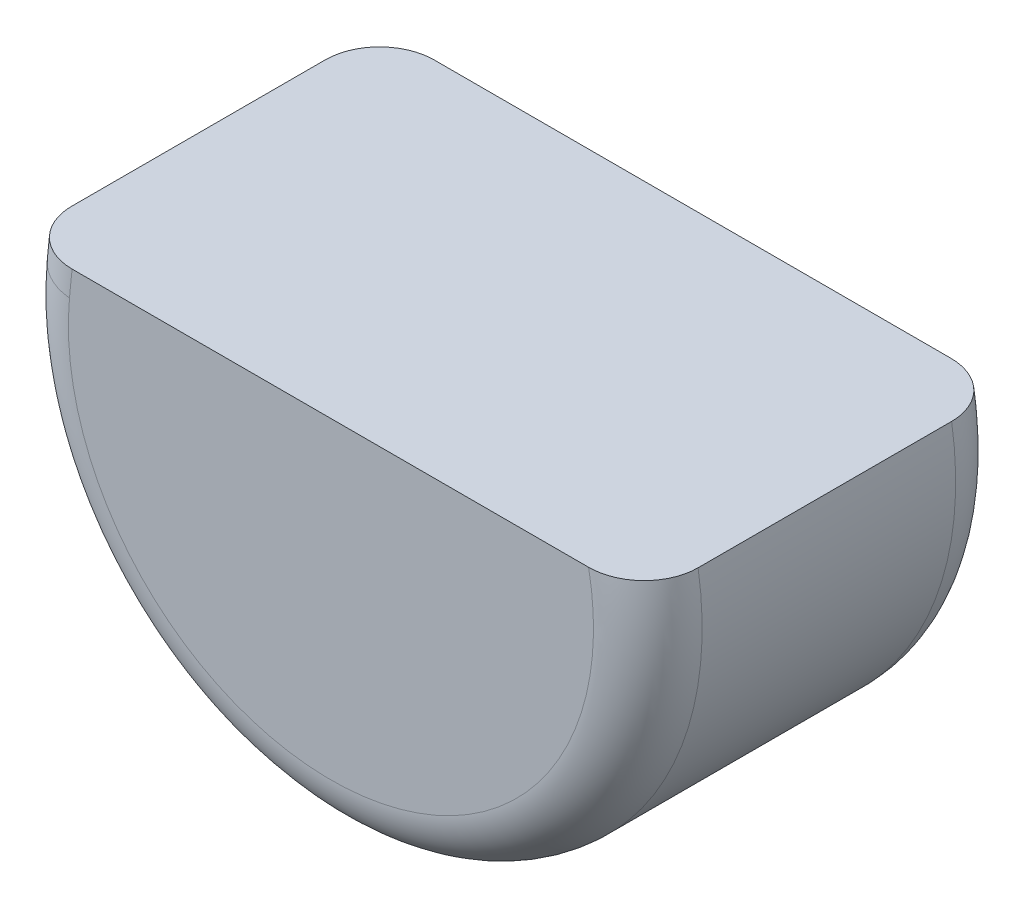
ISO-10303-21;
HEADER;
FILE_DESCRIPTION(('STEP AP214'),'2;1');
FILE_NAME('part.step','',(''),(''),'','','');
FILE_SCHEMA(('AUTOMOTIVE_DESIGN { 1 0 10303 214 1 1 1 1 }'));
ENDSEC;
DATA;
#1=APPLICATION_CONTEXT('core data for automotive mechanical design processes');
#2=APPLICATION_PROTOCOL_DEFINITION('international standard','automotive_design',2000,#1);
#3=PRODUCT_CONTEXT('',#1,'mechanical');
#4=PRODUCT('Part','Part','',(#3));
#5=PRODUCT_RELATED_PRODUCT_CATEGORY('part','',(#4));
#6=PRODUCT_DEFINITION_FORMATION('','',#4);
#7=PRODUCT_DEFINITION_CONTEXT('part definition',#1,'design');
#8=PRODUCT_DEFINITION('design','',#6,#7);
#9=PRODUCT_DEFINITION_SHAPE('','',#8);
#10=(LENGTH_UNIT() NAMED_UNIT(*) SI_UNIT(.MILLI.,.METRE.));
#11=(NAMED_UNIT(*) PLANE_ANGLE_UNIT() SI_UNIT($,.RADIAN.));
#12=(NAMED_UNIT(*) SI_UNIT($,.STERADIAN.) SOLID_ANGLE_UNIT());
#13=UNCERTAINTY_MEASURE_WITH_UNIT(LENGTH_MEASURE(1.E-05),#10,'distance_accuracy_value','');
#14=(GEOMETRIC_REPRESENTATION_CONTEXT(3) GLOBAL_UNCERTAINTY_ASSIGNED_CONTEXT((#13)) GLOBAL_UNIT_ASSIGNED_CONTEXT((#10,
#11,#12)) REPRESENTATION_CONTEXT('',''));
#15=CARTESIAN_POINT('',(0.,0.,0.));
#16=DIRECTION('',(0.,0.,1.));
#17=DIRECTION('',(1.,0.,0.));
#18=AXIS2_PLACEMENT_3D('',#15,#16,#17);
#19=CARTESIAN_POINT('',(0.,33.,0.));
#20=DIRECTION('',(0.,1.,0.));
#21=DIRECTION('',(0.,0.,1.));
#22=AXIS2_PLACEMENT_3D('',#19,#20,#21);
#23=PLANE('',#22);
#24=CARTESIAN_POINT('',(-16.4073101237455,33.,-8.81303590751504));
#25=CARTESIAN_POINT('',(-16.3046430269369,33.,-8.94763315762563));
#26=CARTESIAN_POINT('',(-16.1904843123542,33.,-9.07362536051019));
#27=CARTESIAN_POINT('',(-15.9425101415721,33.,-9.30472810824802));
#28=CARTESIAN_POINT('',(-15.8086699437999,33.,-9.40981197217893));
#29=CARTESIAN_POINT('',(-15.5253491277104,33.,-9.59598278584179));
#30=CARTESIAN_POINT('',(-15.3758795937249,33.,-9.6770865880813));
#31=CARTESIAN_POINT('',(-15.0655275551264,33.,-9.81313260898029));
#32=CARTESIAN_POINT('',(-14.9046478945889,33.,-9.86808132087928));
#33=CARTESIAN_POINT('',(-14.575344004913,33.,-9.9505174006537));
#34=CARTESIAN_POINT('',(-14.4068932463829,33.,-9.97789881371756));
#35=CARTESIAN_POINT('',(-14.0677769562788,33.,-10.0040871476085));
#36=CARTESIAN_POINT('',(-13.8971112886447,33.,-10.0028923046342));
#37=CARTESIAN_POINT('',(-13.5578786420935,33.,-9.97191556360741));
#38=CARTESIAN_POINT('',(-13.389319432232,33.,-9.94204849239308));
#39=CARTESIAN_POINT('',(-13.0596105929529,33.,-9.85442577074404));
#40=CARTESIAN_POINT('',(-12.8984609733782,33.,-9.79667008326352));
#41=CARTESIAN_POINT('',(-12.5882603931464,33.,-9.6549051298579));
#42=CARTESIAN_POINT('',(-12.439202777593,33.,-9.57091042989173));
#43=CARTESIAN_POINT('',(-12.1573801239298,33.,-9.3789924702912));
#44=CARTESIAN_POINT('',(-12.0246147613571,33.,-9.27106968730873));
#45=CARTESIAN_POINT('',(-11.779738166977,33.,-9.03480823569773));
#46=CARTESIAN_POINT('',(-11.6675454851418,33.,-8.90655399821113));
#47=CARTESIAN_POINT('',(-11.4664358089833,33.,-8.6329359440335));
#48=CARTESIAN_POINT('',(-11.3775180972094,33.,-8.48757265492905));
#49=CARTESIAN_POINT('',(-11.2260312484106,33.,-8.18477104622833));
#50=CARTESIAN_POINT('',(-11.1633115824605,33.,-8.02740803158696));
#51=CARTESIAN_POINT('',(-11.0653297341971,33.,-7.70435457149843));
#52=CARTESIAN_POINT('',(-11.0300666937301,33.,-7.53866438648833));
#53=CARTESIAN_POINT('',(-10.988148801575,33.,-7.20453374196073));
#54=CARTESIAN_POINT('',(-10.9813541751074,33.,-7.0361108053519));
#55=CARTESIAN_POINT('',(-10.9961896691112,33.,-6.70052325422526));
#56=CARTESIAN_POINT('',(-11.0178193704601,33.,-6.53335862119005));
#57=CARTESIAN_POINT('',(-11.0888046808636,33.,-6.20531773947316));
#58=CARTESIAN_POINT('',(-11.1381142066283,33.,-6.0444315129845));
#59=CARTESIAN_POINT('',(-11.2629814894278,33.,-5.73319223422878));
#60=CARTESIAN_POINT('',(-11.3385394431608,33.,-5.58283926090504));
#61=CARTESIAN_POINT('',(-11.513919865419,33.,-5.29653222420411));
#62=CARTESIAN_POINT('',(-11.6137996197785,33.,-5.16061325930705));
#63=CARTESIAN_POINT('',(-11.8348500979571,33.,-4.9073616549635));
#64=CARTESIAN_POINT('',(-11.9560213688559,33.,-4.79002949324719));
#65=CARTESIAN_POINT('',(-12.2168901421455,33.,-4.57661586848594));
#66=CARTESIAN_POINT('',(-12.3566817395726,33.,-4.48064942986393));
#67=CARTESIAN_POINT('',(-12.6503193707154,33.,-4.31339186597227));
#68=CARTESIAN_POINT('',(-12.804165848238,33.,-4.24210152023324));
#69=CARTESIAN_POINT('',(-13.1224855965064,33.,-4.1258079593305));
#70=CARTESIAN_POINT('',(-13.2870142572029,33.,-4.08095633438114));
#71=CARTESIAN_POINT('',(-13.6212564743185,33.,-4.0194017969686));
#72=CARTESIAN_POINT('',(-13.7909701556394,33.,-4.00269956314015));
#73=CARTESIAN_POINT('',(-14.1314080635389,33.,-3.99789607920253));
#74=CARTESIAN_POINT('',(-14.3021337378448,33.,-4.00989670429432));
#75=CARTESIAN_POINT('',(-14.639149281904,33.,-4.0623889888193));
#76=CARTESIAN_POINT('',(-14.8054391320297,33.,-4.10288077429893));
#77=CARTESIAN_POINT('',(-15.1288401099813,33.,-4.21124399114672));
#78=CARTESIAN_POINT('',(-15.2859516321,33.,-4.27911424536827));
#79=CARTESIAN_POINT('',(-15.5864954828023,33.,-4.44035707210239));
#80=CARTESIAN_POINT('',(-15.7299279862934,33.,-4.53372931847342));
#81=CARTESIAN_POINT('',(-15.9984932502313,33.,-4.74299851375184));
#82=CARTESIAN_POINT('',(-16.1236878186556,33.,-4.85881613088444));
#83=CARTESIAN_POINT('',(-16.3527289737071,33.,-5.10992569131406));
#84=CARTESIAN_POINT('',(-16.4565761134485,33.,-5.24521712988765));
#85=CARTESIAN_POINT('',(-16.639390331162,33.,-5.53067079704368));
#86=CARTESIAN_POINT('',(-16.7184856087249,33.,-5.68075092255804));
#87=CARTESIAN_POINT('',(-16.8502128288622,33.,-5.99210054459674));
#88=CARTESIAN_POINT('',(-16.9028465841001,33.,-6.15336927381951));
#89=CARTESIAN_POINT('',(-16.9799120399179,33.,-6.48166647270306));
#90=CARTESIAN_POINT('',(-17.0044817541569,33.,-6.64866255903098));
#91=CARTESIAN_POINT('',(-17.0251647419927,33.,-6.98445280821712));
#92=CARTESIAN_POINT('',(-17.0212713753178,33.,-7.15324738147999));
#93=CARTESIAN_POINT('',(-16.9851734955304,33.,-7.4874337722765));
#94=CARTESIAN_POINT('',(-16.953023494492,33.,-7.6528315144982));
#95=CARTESIAN_POINT('',(-16.8614404661866,33.,-7.9757417987829));
#96=CARTESIAN_POINT('',(-16.8020406062447,33.,-8.1332636692647));
#97=CARTESIAN_POINT('',(-16.685477568111,33.,-8.3779560047287));
#98=CARTESIAN_POINT('',(-16.6361766652183,33.,-8.46895779740036));
#99=CARTESIAN_POINT('',(-16.5284498398505,33.,-8.6453886320731));
#100=CARTESIAN_POINT('',(-16.47002393342,33.,-8.73081768387246));
#101=CARTESIAN_POINT('',(-16.4073101237455,33.,-8.81303590751504));
#102=B_SPLINE_CURVE_WITH_KNOTS('',3,(#24,#25,#26,#27,#28,#29,#30,#31,#32,#33,#34,#35,#36,#37,
#38,#39,#40,#41,#42,#43,#44,#45,#46,#47,#48,#49,#50,#51,#52,#53,#54,#55,#56,#57,#58,#59,#60,#61,
#62,#63,#64,#65,#66,#67,#68,#69,#70,#71,#72,#73,#74,#75,#76,#77,#78,#79,#80,#81,#82,#83,#84,#85,
#86,#87,#88,#89,#90,#91,#92,#93,#94,#95,#96,#97,#98,#99,#100,#101),.UNSPECIFIED.,.T.,.F.,(4,2,2,
2,2,2,2,2,2,2,2,2,2,2,2,2,2,2,2,2,2,2,2,2,2,2,2,2,2,2,2,2,2,2,2,2,2,2,4),(0.,0.507470923365044,
1.01558532959512,1.52334179400944,2.0309721374238,2.54054619212493,3.05015169915419,
3.56127572982144,4.07240043944136,4.58324191313572,5.09407321168662,5.60283620489981,
6.11158351365306,6.61736605265214,7.12313278284193,7.62641335836346,8.12968651299219,
8.63212425807561,9.13456576836447,9.63820233866499,10.1418518516626,10.6481505487478,
11.154465238613,11.6636554094113,12.1728578557573,12.6838702973127,13.1948849996292,
13.7058777330356,14.2168639317307,14.7260759769651,15.2352748267933,15.7417909307982,
16.2482723327812,16.7522520832566,17.2563494130337,17.7594763787647,18.2619925787247,
18.5719798273296,18.8819665308845),.UNSPECIFIED.);
#103=CARTESIAN_POINT('',(-17.0204674344962,33.,-6.99999999999999));
#104=VERTEX_POINT('',#103);
#105=CARTESIAN_POINT('',(-14.0037048343602,33.,-9.99999999999999));
#106=VERTEX_POINT('',#105);
#107=EDGE_CURVE('E41',#104,#106,#102,.T.);
#108=ORIENTED_EDGE('',*,*,#107,.F.);
#109=DIRECTION('',(0.,0.,-1.));
#110=VECTOR('',#109,1.);
#111=CARTESIAN_POINT('',(-17.0204674344962,33.,10.));
#112=LINE('',#111,#110);
#113=CARTESIAN_POINT('',(-17.0204674344962,33.,7.00000000000001));
#114=VERTEX_POINT('',#113);
#115=EDGE_CURVE('E157',#104,#114,#112,.F.);
#116=ORIENTED_EDGE('',*,*,#115,.T.);
#117=CARTESIAN_POINT('',(-17.0204248758986,33.,7.01593654982484));
#118=CARTESIAN_POINT('',(-17.0213136364574,33.,6.84811407135562));
#119=CARTESIAN_POINT('',(-17.0080107708837,33.,6.68009375999174));
#120=CARTESIAN_POINT('',(-16.9533436784081,33.,6.34854042206854));
#121=CARTESIAN_POINT('',(-16.9119456602839,33.,6.18501304606332));
#122=CARTESIAN_POINT('',(-16.8023081672937,33.,5.86731153717299));
#123=CARTESIAN_POINT('',(-16.7340844541274,33.,5.71313197317646));
#124=CARTESIAN_POINT('',(-16.5727964134387,33.,5.41842260329393));
#125=CARTESIAN_POINT('',(-16.4797380237194,33.,5.27788954556036));
#126=CARTESIAN_POINT('',(-16.2712021166225,33.,5.01402634912848));
#127=CARTESIAN_POINT('',(-16.1556709821443,33.,4.89073858946166));
#128=CARTESIAN_POINT('',(-15.9056394565939,33.,4.66518406787865));
#129=CARTESIAN_POINT('',(-15.7711378767979,33.,4.56291862424791));
#130=CARTESIAN_POINT('',(-15.4862575283728,33.,4.38175845782016));
#131=CARTESIAN_POINT('',(-15.3358014213151,33.,4.30298535532323));
#132=CARTESIAN_POINT('',(-15.0238480099141,33.,4.17167040771693));
#133=CARTESIAN_POINT('',(-14.8623504011345,33.,4.11912928620776));
#134=CARTESIAN_POINT('',(-14.5320194343979,33.,4.04150734696626));
#135=CARTESIAN_POINT('',(-14.3631530322734,33.,4.01656711925395));
#136=CARTESIAN_POINT('',(-14.0236271371739,33.,3.99530135962949));
#137=CARTESIAN_POINT('',(-13.8529676106123,33.,3.99897636465983));
#138=CARTESIAN_POINT('',(-13.5141834862324,33.,4.03488853843509));
#139=CARTESIAN_POINT('',(-13.3460675470745,33.,4.06720746924314));
#140=CARTESIAN_POINT('',(-13.0176520392605,33.,4.1596294676476));
#141=CARTESIAN_POINT('',(-12.8573524969514,33.,4.21973262889013));
#142=CARTESIAN_POINT('',(-12.5492636824473,33.,4.36600878090439));
#143=CARTESIAN_POINT('',(-12.4014654756577,33.,4.45216294830242));
#144=CARTESIAN_POINT('',(-12.1225099570881,33.,4.64815970971318));
#145=CARTESIAN_POINT('',(-11.9913523259184,33.,4.75800184896327));
#146=CARTESIAN_POINT('',(-11.7500038644396,33.,4.99778348211986));
#147=CARTESIAN_POINT('',(-11.6397278431074,33.,5.12763721756787));
#148=CARTESIAN_POINT('',(-11.4426948763693,33.,5.40410769851143));
#149=CARTESIAN_POINT('',(-11.3559371756911,33.,5.55072390547841));
#150=CARTESIAN_POINT('',(-11.2089391728453,33.,5.85563810116305));
#151=CARTESIAN_POINT('',(-11.1485468118509,33.,6.01386278583103));
#152=CARTESIAN_POINT('',(-11.0553286780791,33.,6.33823386514251));
#153=CARTESIAN_POINT('',(-11.022502065843,33.,6.50438001839097));
#154=CARTESIAN_POINT('',(-10.9854796875921,33.,6.83901965003611));
#155=CARTESIAN_POINT('',(-10.9811468001326,33.,7.00749797060988));
#156=CARTESIAN_POINT('',(-11.0008748469893,33.,7.34278212779973));
#157=CARTESIAN_POINT('',(-11.0249353859534,33.,7.50958798767063));
#158=CARTESIAN_POINT('',(-11.1006827399327,33.,7.83653940722773));
#159=CARTESIAN_POINT('',(-11.1523284068082,33.,7.99669450520807));
#160=CARTESIAN_POINT('',(-11.2817081657202,33.,8.30609283923196));
#161=CARTESIAN_POINT('',(-11.3594424756349,33.,8.45533598413205));
#162=CARTESIAN_POINT('',(-11.5389739902228,33.,8.73909895996857));
#163=CARTESIAN_POINT('',(-11.640831802245,33.,8.87358043795555));
#164=CARTESIAN_POINT('',(-11.8655690837403,33.,9.12364874196134));
#165=CARTESIAN_POINT('',(-11.9884491125334,33.,9.23923506509283));
#166=CARTESIAN_POINT('',(-12.2524378469981,33.,9.44889654286852));
#167=CARTESIAN_POINT('',(-12.393640296507,33.,9.54285365730107));
#168=CARTESIAN_POINT('',(-12.6897449358937,33.,9.70588413161206));
#169=CARTESIAN_POINT('',(-12.844647544526,33.,9.77495673055112));
#170=CARTESIAN_POINT('',(-13.1646942360533,33.,9.88665156471647));
#171=CARTESIAN_POINT('',(-13.3298911158737,33.,9.92912254324015));
#172=CARTESIAN_POINT('',(-13.6650628507862,33.,9.98583356231238));
#173=CARTESIAN_POINT('',(-13.8350378250586,33.,10.0000728980428));
#174=CARTESIAN_POINT('',(-14.1755590987031,33.,9.99992629223732));
#175=CARTESIAN_POINT('',(-14.3461053659078,33.,9.98544238275305));
#176=CARTESIAN_POINT('',(-14.6823470129256,33.,9.92804393837843));
#177=CARTESIAN_POINT('',(-14.8480423617467,33.,9.88512922188793));
#178=CARTESIAN_POINT('',(-15.1698293038638,33.,9.77205649126729));
#179=CARTESIAN_POINT('',(-15.325922692431,33.,9.70190358788442));
#180=CARTESIAN_POINT('',(-15.6240516980891,33.,9.53629906002571));
#181=CARTESIAN_POINT('',(-15.7660880808138,33.,9.44084881444636));
#182=CARTESIAN_POINT('',(-16.0315030137215,33.,9.22771847070338));
#183=CARTESIAN_POINT('',(-16.1549485671976,33.,9.11012181741087));
#184=CARTESIAN_POINT('',(-16.3802469445891,33.,8.85574019270526));
#185=CARTESIAN_POINT('',(-16.4820949661534,33.,8.71895096491098));
#186=CARTESIAN_POINT('',(-16.6607314757035,33.,8.43082184568565));
#187=CARTESIAN_POINT('',(-16.7376387626454,33.,8.27955551569802));
#188=CARTESIAN_POINT('',(-16.8647372211401,33.,7.96633412605654));
#189=CARTESIAN_POINT('',(-16.9149614971125,33.,7.80439259251221));
#190=CARTESIAN_POINT('',(-16.9735999841941,33.,7.53714115933734));
#191=CARTESIAN_POINT('',(-16.9906469062748,33.,7.43364638438056));
#192=CARTESIAN_POINT('',(-17.0137818616026,33.,7.22543896464659));
#193=CARTESIAN_POINT('',(-17.0198699262963,33.,7.12072632336495));
#194=CARTESIAN_POINT('',(-17.0204248758986,33.,7.01593654982484));
#195=B_SPLINE_CURVE_WITH_KNOTS('',3,(#117,#118,#119,#120,#121,#122,#123,#124,#125,#126,#127,
#128,#129,#130,#131,#132,#133,#134,#135,#136,#137,#138,#139,#140,#141,#142,#143,#144,#145,#146,
#147,#148,#149,#150,#151,#152,#153,#154,#155,#156,#157,#158,#159,#160,#161,#162,#163,#164,#165,
#166,#167,#168,#169,#170,#171,#172,#173,#174,#175,#176,#177,#178,#179,#180,#181,#182,#183,#184,
#185,#186,#187,#188,#189,#190,#191,#192,#193,#194),.UNSPECIFIED.,.T.,.F.,(4,2,2,2,2,2,2,2,2,2,2,
2,2,2,2,2,2,2,2,2,2,2,2,2,2,2,2,2,2,2,2,2,2,2,2,2,2,2,4),(0.,0.503090971573607,1.00678810670689,
1.5101897308368,2.01347110270557,2.51796830329335,3.0224971306803,3.52959429558104,
4.0367054478106,4.54638793827909,5.05607999256434,5.56723162935537,6.07838498898387,
6.58916988945866,7.09994498473734,7.60858911590819,8.11721691043877,8.62287120462503,
9.12851009958117,9.63171389717495,10.1349106882067,10.6373589591816,11.1398114264393,
11.6435398917172,12.1472817613534,12.6537108343753,13.1601553920916,13.6694540555144,
14.1787654336915,14.6898169359051,15.200871702462,15.711830625248,16.222761702634,
16.7318048366422,17.2409610412759,17.7476551153788,18.2537190800382,18.5678542348733,
18.8819884882948),.UNSPECIFIED.);
#196=CARTESIAN_POINT('',(-14.0037048343602,33.,10.));
#197=VERTEX_POINT('',#196);
#198=EDGE_CURVE('E121',#197,#114,#195,.T.);
#199=ORIENTED_EDGE('',*,*,#198,.F.);
#200=DIRECTION('',(-1.,0.,0.));
#201=VECTOR('',#200,1.);
#202=CARTESIAN_POINT('',(47.0492055521793,33.,10.));
#203=LINE('',#202,#201);
#204=CARTESIAN_POINT('',(14.5189629075543,33.,10.));
#205=VERTEX_POINT('',#204);
#206=EDGE_CURVE('E158',#205,#197,#203,.T.);
#207=ORIENTED_EDGE('',*,*,#206,.F.);
#208=CARTESIAN_POINT('',(11.6102886868545,33.,7.96378165278556));
#209=CARTESIAN_POINT('',(11.5561989360634,33.,7.80894350169198));
#210=CARTESIAN_POINT('',(11.515042002115,33.,7.64947446571004));
#211=CARTESIAN_POINT('',(11.4600735989835,33.,7.32577539608614));
#212=CARTESIAN_POINT('',(11.4462882618244,33.,7.1615409644513));
#213=CARTESIAN_POINT('',(11.446594989443,33.,6.83313025606573));
#214=CARTESIAN_POINT('',(11.4606794468749,33.,6.66895397567651));
#215=CARTESIAN_POINT('',(11.5162206542621,33.,6.34534194833683));
#216=CARTESIAN_POINT('',(11.5576726189565,33.,6.18590537773123));
#217=CARTESIAN_POINT('',(11.6665487265678,33.,5.87613276561319));
#218=CARTESIAN_POINT('',(11.7339794768822,33.,5.72579905056982));
#219=CARTESIAN_POINT('',(11.8926404358899,33.,5.43827042660729));
#220=CARTESIAN_POINT('',(11.9838733841002,33.,5.30107703256152));
#221=CARTESIAN_POINT('',(12.1894334832384,33.,5.0407148261468));
#222=CARTESIAN_POINT('',(12.3041890767046,33.,4.91788445065731));
#223=CARTESIAN_POINT('',(12.5522147644531,33.,4.69261370771054));
#224=CARTESIAN_POINT('',(12.6854873499631,33.,4.59017608836018));
#225=CARTESIAN_POINT('',(12.9705845424177,33.,4.40577350735854));
#226=CARTESIAN_POINT('',(13.1228081014657,33.,4.32442507166192));
#227=CARTESIAN_POINT('',(13.438582954502,33.,4.1879281502731));
#228=CARTESIAN_POINT('',(13.6021354108815,33.,4.13278235765507));
#229=CARTESIAN_POINT('',(13.9390046289141,33.,4.04940938829727));
#230=CARTESIAN_POINT('',(14.1124419134337,33.,4.02166829194393));
#231=CARTESIAN_POINT('',(14.4615192687116,33.,3.9956213805549));
#232=CARTESIAN_POINT('',(14.637159406673,33.,3.99731646573098));
#233=CARTESIAN_POINT('',(14.9860391518049,33.,4.03025730109238));
#234=CARTESIAN_POINT('',(15.1592727792543,33.,4.06156663993168));
#235=CARTESIAN_POINT('',(15.4979249809462,33.,4.15311861219944));
#236=CARTESIAN_POINT('',(15.6633438792356,33.,4.2133600447661));
#237=CARTESIAN_POINT('',(15.9798760594435,33.,4.36049394374254));
#238=CARTESIAN_POINT('',(16.1311152560281,33.,4.44711539304716));
#239=CARTESIAN_POINT('',(16.4166052311667,33.,4.64488980505213));
#240=CARTESIAN_POINT('',(16.550857346021,33.,4.75604083622617));
#241=CARTESIAN_POINT('',(16.7963941197603,33.,4.99791884040762));
#242=CARTESIAN_POINT('',(16.9079951904191,33.,5.1283246136132));
#243=CARTESIAN_POINT('',(17.1073427848729,33.,5.40624897454374));
#244=CARTESIAN_POINT('',(17.1950912392259,33.,5.55376617594225));
#245=CARTESIAN_POINT('',(17.3429667860165,33.,5.85947335086762));
#246=CARTESIAN_POINT('',(17.4034666433694,33.,6.01748306845187));
#247=CARTESIAN_POINT('',(17.4967989769561,33.,6.34147202180842));
#248=CARTESIAN_POINT('',(17.5296330899555,33.,6.50745078550043));
#249=CARTESIAN_POINT('',(17.5664541296584,33.,6.84101347815235));
#250=CARTESIAN_POINT('',(17.5707059050332,33.,7.00856822160024));
#251=CARTESIAN_POINT('',(17.5509376214868,33.,7.34199836332419));
#252=CARTESIAN_POINT('',(17.5269182995193,33.,7.50787380526158));
#253=CARTESIAN_POINT('',(17.4514350836094,33.,7.83279922049417));
#254=CARTESIAN_POINT('',(17.4000423911084,33.,7.99186575014402));
#255=CARTESIAN_POINT('',(17.2713962531224,33.,8.29916734472704));
#256=CARTESIAN_POINT('',(17.1941425273791,33.,8.44740229225617));
#257=CARTESIAN_POINT('',(17.0156579204929,33.,8.72958001796193));
#258=CARTESIAN_POINT('',(16.9143214895607,33.,8.86345600493979));
#259=CARTESIAN_POINT('',(16.6908285267304,33.,9.11251721553654));
#260=CARTESIAN_POINT('',(16.5686710963877,33.,9.22770163217884));
#261=CARTESIAN_POINT('',(16.3056425677403,33.,9.43745848668873));
#262=CARTESIAN_POINT('',(16.1645858832827,33.,9.53179814061515));
#263=CARTESIAN_POINT('',(15.8688180800916,33.,9.69585090547146));
#264=CARTESIAN_POINT('',(15.7141059687661,33.,9.76556222435976));
#265=CARTESIAN_POINT('',(15.3930101603211,33.,9.87947076241723));
#266=CARTESIAN_POINT('',(15.2264889788829,33.,9.92328039420827));
#267=CARTESIAN_POINT('',(14.8884956618606,33.,9.98276119323626));
#268=CARTESIAN_POINT('',(14.7170231111161,33.,9.9984299939304));
#269=CARTESIAN_POINT('',(14.3713446311439,33.,10.0013662875464));
#270=CARTESIAN_POINT('',(14.1971351163459,33.,9.98821871464553));
#271=CARTESIAN_POINT('',(13.853333309359,33.,9.93311778788711));
#272=CARTESIAN_POINT('',(13.6837411621287,33.,9.89116353074905));
#273=CARTESIAN_POINT('',(13.3525704265382,33.,9.77914785172742));
#274=CARTESIAN_POINT('',(13.1910675682191,33.,9.70886229659813));
#275=CARTESIAN_POINT('',(12.8821784767766,33.,9.54202752248851));
#276=CARTESIAN_POINT('',(12.7347958582311,33.,9.44547160283344));
#277=CARTESIAN_POINT('',(12.4592351387971,33.,9.22917627361162));
#278=CARTESIAN_POINT('',(12.3309735512289,33.,9.10954321341865));
#279=CARTESIAN_POINT('',(12.0969964985273,33.,8.85012747651096));
#280=CARTESIAN_POINT('',(11.9912511405565,33.,8.71037193335608));
#281=CARTESIAN_POINT('',(11.8394910489936,33.,8.46855802957089));
#282=CARTESIAN_POINT('',(11.7857383238132,33.,8.37126935910582));
#283=CARTESIAN_POINT('',(11.6894446826134,33.,8.17128828658046));
#284=CARTESIAN_POINT('',(11.6469035699574,33.,8.06859597933063));
#285=CARTESIAN_POINT('',(11.6102886868545,33.,7.96378165278556));
#286=B_SPLINE_CURVE_WITH_KNOTS('',3,(#208,#209,#210,#211,#212,#213,#214,#215,#216,#217,#218,
#219,#220,#221,#222,#223,#224,#225,#226,#227,#228,#229,#230,#231,#232,#233,#234,#235,#236,#237,
#238,#239,#240,#241,#242,#243,#244,#245,#246,#247,#248,#249,#250,#251,#252,#253,#254,#255,#256,
#257,#258,#259,#260,#261,#262,#263,#264,#265,#266,#267,#268,#269,#270,#271,#272,#273,#274,#275,
#276,#277,#278,#279,#280,#281,#282,#283,#284,#285),.UNSPECIFIED.,.T.,.F.,(4,2,2,2,2,2,2,2,2,2,2,
2,2,2,2,2,2,2,2,2,2,2,2,2,2,2,2,2,2,2,2,2,2,2,2,2,2,2,4),(0.,0.491641513464318,
0.983752178299271,1.47572853501785,1.96761889150443,2.45963443717518,2.95170663643837,
3.45369756201729,3.95575608965498,4.47115915675456,4.98661518487018,5.51105803054855,
6.03551691466748,6.56110449595807,7.08667026398081,7.60700900654132,8.12730679081779,
8.63974219057132,9.15213610300956,9.65728999837811,10.1624140056438,10.6628509199901,
11.1632747895383,11.6624033077373,12.1615372352122,12.6629004802308,13.1642853649951,
13.6710143865868,14.1777802719187,14.691949020079,15.2061610059597,15.7278282190855,
16.2495117906838,16.7754061226355,17.3014347182666,17.8250946890669,18.348055046575,
18.6808669384334,19.0136729928289),.UNSPECIFIED.);
#287=CARTESIAN_POINT('',(17.5660131781166,33.,7.00000000000001));
#288=VERTEX_POINT('',#287);
#289=EDGE_CURVE('E130',#288,#205,#286,.T.);
#290=ORIENTED_EDGE('',*,*,#289,.F.);
#291=DIRECTION('',(0.,0.,-1.));
#292=VECTOR('',#291,1.);
#293=CARTESIAN_POINT('',(17.5660131781166,33.,10.));
#294=LINE('',#293,#292);
#295=CARTESIAN_POINT('',(17.5660131781166,33.,-6.99999999999999));
#296=VERTEX_POINT('',#295);
#297=EDGE_CURVE('E11',#288,#296,#294,.T.);
#298=ORIENTED_EDGE('',*,*,#297,.T.);
#299=CARTESIAN_POINT('',(11.6102886868545,33.,-7.96378165278554));
#300=CARTESIAN_POINT('',(11.6659660354879,33.,-8.12311563784938));
#301=CARTESIAN_POINT('',(11.7354248741021,33.,-8.27778219698602));
#302=CARTESIAN_POINT('',(11.899570104065,33.,-8.57327357988291));
#303=CARTESIAN_POINT('',(11.9942937999616,33.,-8.71407751056114));
#304=CARTESIAN_POINT('',(12.2057333355745,33.,-8.97768973143249));
#305=CARTESIAN_POINT('',(12.3224132145569,33.,-9.10052687178769));
#306=CARTESIAN_POINT('',(12.5743372300363,33.,-9.3252942620895));
#307=CARTESIAN_POINT('',(12.7095769853463,33.,-9.42722943196897));
#308=CARTESIAN_POINT('',(12.9976451418846,33.,-9.60949835631384));
#309=CARTESIAN_POINT('',(13.1507665697555,33.,-9.6893690574809));
#310=CARTESIAN_POINT('',(13.4680921978104,33.,-9.82277700576562));
#311=CARTESIAN_POINT('',(13.6322979785954,33.,-9.87631048820243));
#312=CARTESIAN_POINT('',(13.9701512777869,33.,-9.95631251056429));
#313=CARTESIAN_POINT('',(14.1439121424467,33.,-9.98230328070578));
#314=CARTESIAN_POINT('',(14.4933386740929,33.,-10.0048059484243));
#315=CARTESIAN_POINT('',(14.6690043929403,33.,-10.0013170413712));
#316=CARTESIAN_POINT('',(15.01755173538,33.,-9.96479562216142));
#317=CARTESIAN_POINT('',(15.190428096303,33.,-9.9317127035916));
#318=CARTESIAN_POINT('',(15.5280666100416,33.,-9.83669193713391));
#319=CARTESIAN_POINT('',(15.6928291336649,33.,-9.77475540923028));
#320=CARTESIAN_POINT('',(16.0077299465434,33.,-9.62439597557291));
#321=CARTESIAN_POINT('',(16.1580003388813,33.,-9.53624986641832));
#322=CARTESIAN_POINT('',(16.4413058496228,33.,-9.33561232700703));
#323=CARTESIAN_POINT('',(16.5743423099906,33.,-9.22312279413724));
#324=CARTESIAN_POINT('',(16.8172491861191,33.,-8.97882111556683));
#325=CARTESIAN_POINT('',(16.9274402572985,33.,-8.84732779329861));
#326=CARTESIAN_POINT('',(17.1238057305323,33.,-8.56748622618583));
#327=CARTESIAN_POINT('',(17.2099820788938,33.,-8.41913934863402));
#328=CARTESIAN_POINT('',(17.3546303637733,33.,-8.11205045992561));
#329=CARTESIAN_POINT('',(17.4134739789617,33.,-7.9534834637517));
#330=CARTESIAN_POINT('',(17.5034288253889,33.,-7.62866993757589));
#331=CARTESIAN_POINT('',(17.5345416693189,33.,-7.46242385474501));
#332=CARTESIAN_POINT('',(17.5679276286514,33.,-7.12859325962095));
#333=CARTESIAN_POINT('',(17.5704604729616,33.,-6.96103467286007));
#334=CARTESIAN_POINT('',(17.5472845970762,33.,-6.62788538353964));
#335=CARTESIAN_POINT('',(17.5215765800574,33.,-6.4622946320862));
#336=CARTESIAN_POINT('',(17.442792611614,33.,-6.13817954380402));
#337=CARTESIAN_POINT('',(17.389781775886,33.,-5.97963936470821));
#338=CARTESIAN_POINT('',(17.2580155422371,33.,-5.67365072198737));
#339=CARTESIAN_POINT('',(17.1792598468741,33.,-5.5262023865356));
#340=CARTESIAN_POINT('',(16.9979048318186,33.,-5.24580679903089));
#341=CARTESIAN_POINT('',(16.8951958298508,33.,-5.11293051716667));
#342=CARTESIAN_POINT('',(16.6691459587028,33.,-4.86607910246859));
#343=CARTESIAN_POINT('',(16.545804159958,33.,-4.75210482168309));
#344=CARTESIAN_POINT('',(16.280593271685,33.,-4.54493919620644));
#345=CARTESIAN_POINT('',(16.1385381668704,33.,-4.45198605134931));
#346=CARTESIAN_POINT('',(15.8410175699533,33.,-4.29085049464106));
#347=CARTESIAN_POINT('',(15.6855511158926,33.,-4.22266986148336));
#348=CARTESIAN_POINT('',(15.3631882661897,33.,-4.11194367250548));
#349=CARTESIAN_POINT('',(15.196157606068,33.,-4.06978903743991));
#350=CARTESIAN_POINT('',(14.8574260574004,33.,-4.01368223193832));
#351=CARTESIAN_POINT('',(14.6857247882605,33.,-3.99973236684428));
#352=CARTESIAN_POINT('',(14.3398925700469,33.,-4.00027930744516));
#353=CARTESIAN_POINT('',(14.1657622104467,33.,-4.01518832668161));
#354=CARTESIAN_POINT('',(13.8224059625144,33.,-4.07378351442039));
#355=CARTESIAN_POINT('',(13.6531804173277,33.,-4.1174716912896));
#356=CARTESIAN_POINT('',(13.3230691622999,33.,-4.2328886778394));
#357=CARTESIAN_POINT('',(13.162259604966,33.,-4.304835552609));
#358=CARTESIAN_POINT('',(12.8550780303576,33.,-4.4748430305627));
#359=CARTESIAN_POINT('',(12.7087060948507,33.,-4.57290378163141));
#360=CARTESIAN_POINT('',(12.4355386521921,33.,-4.79193455696138));
#361=CARTESIAN_POINT('',(12.3086408131001,33.,-4.91277682901226));
#362=CARTESIAN_POINT('',(12.0774630330773,33.,-5.17444869002111));
#363=CARTESIAN_POINT('',(11.9731796572297,33.,-5.31527523817883));
#364=CARTESIAN_POINT('',(11.7926370267818,33.,-5.60979982413954));
#365=CARTESIAN_POINT('',(11.7158334428639,33.,-5.76316401534356));
#366=CARTESIAN_POINT('',(11.5898682716146,33.,-6.08090373714391));
#367=CARTESIAN_POINT('',(11.5407089054594,33.,-6.24528015137049));
#368=CARTESIAN_POINT('',(11.4727455925817,33.,-6.57562306833267));
#369=CARTESIAN_POINT('',(11.4531710925069,33.,-6.74143175641189));
#370=CARTESIAN_POINT('',(11.4426426930756,33.,-7.07380411630036));
#371=CARTESIAN_POINT('',(11.4516492279271,33.,-7.24036642593689));
#372=CARTESIAN_POINT('',(11.488063927309,33.,-7.49992934574703));
#373=CARTESIAN_POINT('',(11.5061137236002,33.,-7.59433933589713));
#374=CARTESIAN_POINT('',(11.5513844838587,33.,-7.78093053580681));
#375=CARTESIAN_POINT('',(11.5786051973136,33.,-7.87311180637231));
#376=CARTESIAN_POINT('',(11.6102886868545,33.,-7.96378165278554));
#377=B_SPLINE_CURVE_WITH_KNOTS('',3,(#299,#300,#301,#302,#303,#304,#305,#306,#307,#308,#309,
#310,#311,#312,#313,#314,#315,#316,#317,#318,#319,#320,#321,#322,#323,#324,#325,#326,#327,#328,
#329,#330,#331,#332,#333,#334,#335,#336,#337,#338,#339,#340,#341,#342,#343,#344,#345,#346,#347,
#348,#349,#350,#351,#352,#353,#354,#355,#356,#357,#358,#359,#360,#361,#362,#363,#364,#365,#366,
#367,#368,#369,#370,#371,#372,#373,#374,#375,#376),.UNSPECIFIED.,.T.,.F.,(4,2,2,2,2,2,2,2,2,2,2,
2,2,2,2,2,2,2,2,2,2,2,2,2,2,2,2,2,2,2,2,2,2,2,2,2,2,2,4),(0.,0.505982844354649,1.01271696816696,
1.51862825414669,2.02442032102977,2.54013591279037,3.055925200295,3.58052208798368,
4.10513329427697,4.63063975689814,5.15612218120483,5.67624105532741,6.19631940468484,
6.7085124592426,7.22066399031002,7.72563107235716,8.23056878598075,8.73091399821841,
9.23124675250579,9.73039172896896,10.2295424724825,10.7310253327082,11.2325307922117,
11.7394622220326,12.2464300428945,12.7608384037139,13.2752888084593,13.7971417500932,
14.3190311133355,14.8450294863163,15.3710308381239,15.8941658330695,16.4172213131641,
16.9292525354539,17.441324892894,17.9398152104875,18.437615750546,18.7255558273928,
19.0134880395131),.UNSPECIFIED.);
#378=CARTESIAN_POINT('',(14.5189629075543,33.,-9.99999999999999));
#379=VERTEX_POINT('',#378);
#380=EDGE_CURVE('E134',#379,#296,#377,.T.);
#381=ORIENTED_EDGE('',*,*,#380,.F.);
#382=DIRECTION('',(-1.,0.,0.));
#383=VECTOR('',#382,1.);
#384=CARTESIAN_POINT('',(47.0492055521793,33.,-9.99999999999999));
#385=LINE('',#384,#383);
#386=EDGE_CURVE('E50',#379,#106,#385,.T.);
#387=ORIENTED_EDGE('',*,*,#386,.T.);
#388=EDGE_LOOP('',(#108,#116,#199,#207,#290,#298,#381,#387));
#389=FACE_BOUND('',#388,.T.);
#390=ADVANCED_FACE('F37',(#389),#23,.T.);
#391=CARTESIAN_POINT('',(82.4405999624764,22.6319687377559,10.));
#392=DIRECTION('',(0.,0.,-1.));
#393=DIRECTION('',(-0.903921390927474,0.427698631075364,0.));
#394=AXIS2_PLACEMENT_3D('',#391,#392,#393);
#395=CYLINDRICAL_SURFACE('',#394,100.);
#396=ORIENTED_EDGE('',*,*,#115,.F.);
#397=CARTESIAN_POINT('',(82.4405999624764,22.6319687377559,-6.99999999999999));
#398=DIRECTION('',(0.,0.,1.));
#399=DIRECTION('',(0.903921390927474,-0.427698631075364,0.));
#400=AXIS2_PLACEMENT_3D('',#397,#398,#399);
#401=CIRCLE('',#400,100.);
#402=CARTESIAN_POINT('',(-17.1364326319272,31.8197094661983,-6.99999999999999));
#403=VERTEX_POINT('',#402);
#404=EDGE_CURVE('E111',#104,#403,#401,.T.);
#405=ORIENTED_EDGE('',*,*,#404,.T.);
#406=DIRECTION('',(0.,0.,-1.));
#407=VECTOR('',#406,1.);
#408=CARTESIAN_POINT('',(-17.1364326319272,31.8197094661983,10.));
#409=LINE('',#408,#407);
#410=CARTESIAN_POINT('',(-17.1364326319272,31.8197094661983,7.00000000000001));
#411=VERTEX_POINT('',#410);
#412=EDGE_CURVE('E100',#411,#403,#409,.T.);
#413=ORIENTED_EDGE('',*,*,#412,.F.);
#414=CARTESIAN_POINT('',(82.4405999624764,22.6319687377559,7.00000000000001));
#415=DIRECTION('',(0.,0.,1.));
#416=DIRECTION('',(0.903921390927474,-0.427698631075364,0.));
#417=AXIS2_PLACEMENT_3D('',#414,#415,#416);
#418=CIRCLE('',#417,100.);
#419=EDGE_CURVE('E110',#411,#114,#418,.F.);
#420=ORIENTED_EDGE('',*,*,#419,.T.);
#421=EDGE_LOOP('',(#396,#405,#413,#420));
#422=FACE_BOUND('',#421,.T.);
#423=ADVANCED_FACE('F109',(#422),#395,.T.);
#424=CARTESIAN_POINT('',(82.4405999624764,22.6319687377559,-6.99999999999999));
#425=DIRECTION('',(0.,0.,1.));
#426=DIRECTION('',(0.903921390927474,-0.427698631075364,0.));
#427=AXIS2_PLACEMENT_3D('',#424,#425,#426);
#428=TOROIDAL_SURFACE('',#427,97.,3.);
#429=ORIENTED_EDGE('',*,*,#404,.F.);
#430=ORIENTED_EDGE('',*,*,#107,.T.);
#431=CARTESIAN_POINT('',(82.4405999624764,22.6319687377559,-9.99999999999999));
#432=DIRECTION('',(0.,0.,1.));
#433=DIRECTION('',(0.903921390927474,-0.427698631075364,0.));
#434=AXIS2_PLACEMENT_3D('',#431,#432,#433);
#435=CIRCLE('',#434,97.);
#436=CARTESIAN_POINT('',(-14.1491216540951,31.544077244345,-9.99999999999999));
#437=VERTEX_POINT('',#436);
#438=EDGE_CURVE('E104',#437,#106,#435,.F.);
#439=ORIENTED_EDGE('',*,*,#438,.F.);
#440=CARTESIAN_POINT('',(-14.1491216540951,31.544077244345,-6.99999999999999));
#441=DIRECTION('',(0.0918774072844239,0.995770325944036,0.));
#442=DIRECTION('',(-0.995770325944036,0.0918774072844239,0.));
#443=AXIS2_PLACEMENT_3D('',#440,#441,#442);
#444=CIRCLE('',#443,3.);
#445=EDGE_CURVE('E113',#437,#403,#444,.T.);
#446=ORIENTED_EDGE('',*,*,#445,.T.);
#447=EDGE_LOOP('',(#429,#430,#439,#446));
#448=FACE_BOUND('',#447,.T.);
#449=ADVANCED_FACE('F145',(#448),#428,.T.);
#450=CARTESIAN_POINT('',(82.4405999624764,22.6319687377559,7.00000000000001));
#451=DIRECTION('',(0.,0.,1.));
#452=DIRECTION('',(0.903921390927474,-0.427698631075364,0.));
#453=AXIS2_PLACEMENT_3D('',#450,#451,#452);
#454=TOROIDAL_SURFACE('',#453,97.,3.);
#455=CARTESIAN_POINT('',(82.4405999624764,22.6319687377559,10.));
#456=DIRECTION('',(0.,0.,1.));
#457=DIRECTION('',(0.903921390927474,-0.427698631075364,0.));
#458=AXIS2_PLACEMENT_3D('',#455,#456,#457);
#459=CIRCLE('',#458,97.);
#460=CARTESIAN_POINT('',(-14.1491216540951,31.544077244345,10.));
#461=VERTEX_POINT('',#460);
#462=EDGE_CURVE('E135',#197,#461,#459,.T.);
#463=ORIENTED_EDGE('',*,*,#462,.F.);
#464=ORIENTED_EDGE('',*,*,#198,.T.);
#465=ORIENTED_EDGE('',*,*,#419,.F.);
#466=CARTESIAN_POINT('',(-14.1491216540951,31.544077244345,7.00000000000001));
#467=DIRECTION('',(0.091877407284424,0.995770325944036,0.));
#468=DIRECTION('',(-0.995770325944036,0.091877407284424,0.));
#469=AXIS2_PLACEMENT_3D('',#466,#467,#468);
#470=CIRCLE('',#469,3.);
#471=EDGE_CURVE('E119',#411,#461,#470,.T.);
#472=ORIENTED_EDGE('',*,*,#471,.T.);
#473=EDGE_LOOP('',(#463,#464,#465,#472));
#474=FACE_BOUND('',#473,.T.);
#475=ADVANCED_FACE('F118',(#474),#454,.T.);
#476=CARTESIAN_POINT('',(47.0492055521793,140.726715524264,10.));
#477=DIRECTION('',(0.,0.,1.));
#478=DIRECTION('',(0.903921390927474,-0.427698631075364,0.));
#479=AXIS2_PLACEMENT_3D('',#476,#477,#478);
#480=PLANE('',#479);
#481=CARTESIAN_POINT('',(0.289548072093415,30.2118548387208,10.));
#482=DIRECTION('',(0.,0.,1.));
#483=DIRECTION('',(0.903921390927474,-0.427698631075364,0.));
#484=AXIS2_PLACEMENT_3D('',#481,#482,#483);
#485=CIRCLE('',#484,14.5);
#486=EDGE_CURVE('E125',#461,#205,#485,.T.);
#487=ORIENTED_EDGE('',*,*,#486,.T.);
#488=ORIENTED_EDGE('',*,*,#206,.T.);
#489=ORIENTED_EDGE('',*,*,#462,.T.);
#490=EDGE_LOOP('',(#487,#488,#489));
#491=FACE_BOUND('',#490,.T.);
#492=ADVANCED_FACE('F144',(#491),#480,.T.);
#493=CARTESIAN_POINT('',(0.289548072093415,30.2118548387208,10.));
#494=DIRECTION('',(0.,0.,-1.));
#495=DIRECTION('',(-0.903921390927474,0.427698631075364,0.));
#496=AXIS2_PLACEMENT_3D('',#493,#494,#495);
#497=CYLINDRICAL_SURFACE('',#496,17.5);
#498=ORIENTED_EDGE('',*,*,#297,.F.);
#499=CARTESIAN_POINT('',(0.289548072093415,30.2118548387208,7.00000000000001));
#500=DIRECTION('',(0.,0.,1.));
#501=DIRECTION('',(0.903921390927474,-0.427698631075364,0.));
#502=AXIS2_PLACEMENT_3D('',#499,#500,#501);
#503=CIRCLE('',#502,17.5);
#504=EDGE_CURVE('E96',#288,#411,#503,.F.);
#505=ORIENTED_EDGE('',*,*,#504,.T.);
#506=ORIENTED_EDGE('',*,*,#412,.T.);
#507=CARTESIAN_POINT('',(0.289548072093415,30.2118548387208,-6.99999999999999));
#508=DIRECTION('',(0.,0.,1.));
#509=DIRECTION('',(0.903921390927474,-0.427698631075364,0.));
#510=AXIS2_PLACEMENT_3D('',#507,#508,#509);
#511=CIRCLE('',#510,17.5);
#512=EDGE_CURVE('E103',#403,#296,#511,.T.);
#513=ORIENTED_EDGE('',*,*,#512,.T.);
#514=EDGE_LOOP('',(#498,#505,#506,#513));
#515=FACE_BOUND('',#514,.T.);
#516=ADVANCED_FACE('F98',(#515),#497,.T.);
#517=CARTESIAN_POINT('',(0.289548072093415,30.2118548387208,7.00000000000001));
#518=DIRECTION('',(0.,0.,1.));
#519=DIRECTION('',(0.903921390927474,-0.427698631075364,0.));
#520=AXIS2_PLACEMENT_3D('',#517,#518,#519);
#521=TOROIDAL_SURFACE('',#520,14.5,3.);
#522=ORIENTED_EDGE('',*,*,#504,.F.);
#523=ORIENTED_EDGE('',*,*,#289,.T.);
#524=ORIENTED_EDGE('',*,*,#486,.F.);
#525=ORIENTED_EDGE('',*,*,#471,.F.);
#526=EDGE_LOOP('',(#522,#523,#524,#525));
#527=FACE_BOUND('',#526,.T.);
#528=ADVANCED_FACE('F123',(#527),#521,.T.);
#529=CARTESIAN_POINT('',(47.0492055521793,140.726715524264,-9.99999999999999));
#530=DIRECTION('',(0.,0.,1.));
#531=DIRECTION('',(0.903921390927474,-0.427698631075364,0.));
#532=AXIS2_PLACEMENT_3D('',#529,#530,#531);
#533=PLANE('',#532);
#534=ORIENTED_EDGE('',*,*,#386,.F.);
#535=CARTESIAN_POINT('',(0.289548072093415,30.2118548387208,-9.99999999999999));
#536=DIRECTION('',(0.,0.,1.));
#537=DIRECTION('',(0.903921390927474,-0.427698631075364,0.));
#538=AXIS2_PLACEMENT_3D('',#535,#536,#537);
#539=CIRCLE('',#538,14.5);
#540=EDGE_CURVE('E167',#379,#437,#539,.F.);
#541=ORIENTED_EDGE('',*,*,#540,.T.);
#542=ORIENTED_EDGE('',*,*,#438,.T.);
#543=EDGE_LOOP('',(#534,#541,#542));
#544=FACE_BOUND('',#543,.T.);
#545=ADVANCED_FACE('F140',(#544),#533,.F.);
#546=CARTESIAN_POINT('',(0.289548072093415,30.2118548387208,-6.99999999999999));
#547=DIRECTION('',(0.,0.,1.));
#548=DIRECTION('',(0.903921390927474,-0.427698631075364,0.));
#549=AXIS2_PLACEMENT_3D('',#546,#547,#548);
#550=TOROIDAL_SURFACE('',#549,14.5,3.);
#551=ORIENTED_EDGE('',*,*,#540,.F.);
#552=ORIENTED_EDGE('',*,*,#380,.T.);
#553=ORIENTED_EDGE('',*,*,#512,.F.);
#554=ORIENTED_EDGE('',*,*,#445,.F.);
#555=EDGE_LOOP('',(#551,#552,#553,#554));
#556=FACE_BOUND('',#555,.T.);
#557=ADVANCED_FACE('F146',(#556),#550,.T.);
#558=CLOSED_SHELL('',(#390,#423,#449,#475,#492,#516,#528,#545,#557));
#559=MANIFOLD_SOLID_BREP('B2',#558);
#560=ADVANCED_BREP_SHAPE_REPRESENTATION('',(#18,#559),#14);
#561=SHAPE_DEFINITION_REPRESENTATION(#9,#560);
ENDSEC;
END-ISO-10303-21;
